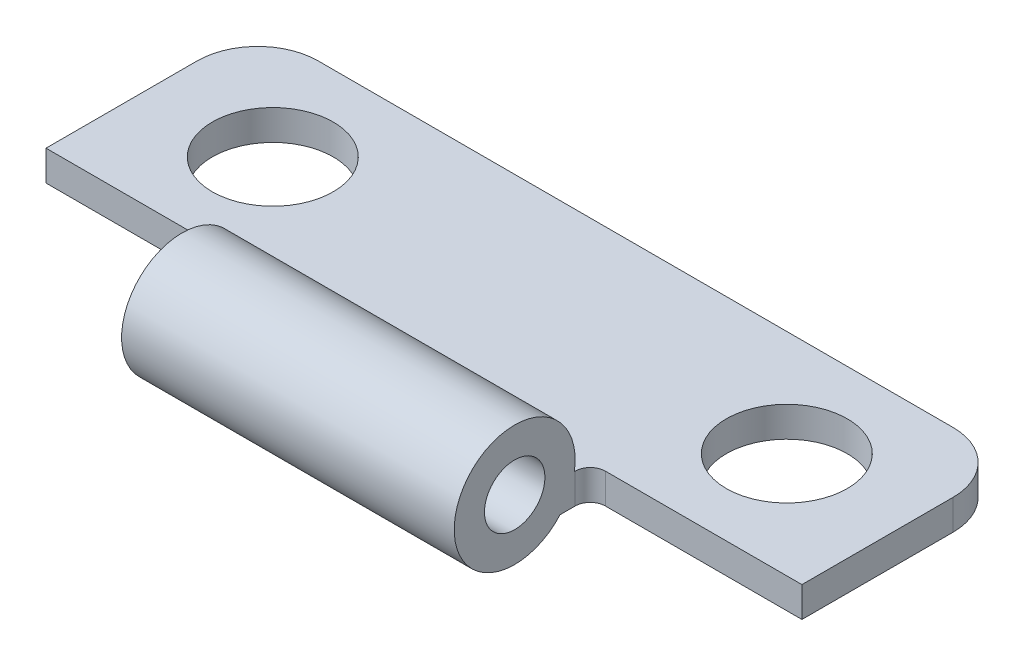
ISO-10303-21;
HEADER;
FILE_DESCRIPTION(('STEP AP214'),'2;1');
FILE_NAME('part.step','',(''),(''),'','','');
FILE_SCHEMA(('AUTOMOTIVE_DESIGN { 1 0 10303 214 1 1 1 1 }'));
ENDSEC;
DATA;
#1=APPLICATION_CONTEXT('core data for automotive mechanical design processes');
#2=APPLICATION_PROTOCOL_DEFINITION('international standard','automotive_design',2000,#1);
#3=PRODUCT_CONTEXT('',#1,'mechanical');
#4=PRODUCT('Part','Part','',(#3));
#5=PRODUCT_RELATED_PRODUCT_CATEGORY('part','',(#4));
#6=PRODUCT_DEFINITION_FORMATION('','',#4);
#7=PRODUCT_DEFINITION_CONTEXT('part definition',#1,'design');
#8=PRODUCT_DEFINITION('design','',#6,#7);
#9=PRODUCT_DEFINITION_SHAPE('','',#8);
#10=(LENGTH_UNIT() NAMED_UNIT(*) SI_UNIT(.MILLI.,.METRE.));
#11=(NAMED_UNIT(*) PLANE_ANGLE_UNIT() SI_UNIT($,.RADIAN.));
#12=(NAMED_UNIT(*) SI_UNIT($,.STERADIAN.) SOLID_ANGLE_UNIT());
#13=UNCERTAINTY_MEASURE_WITH_UNIT(LENGTH_MEASURE(1.E-05),#10,'distance_accuracy_value','');
#14=(GEOMETRIC_REPRESENTATION_CONTEXT(3) GLOBAL_UNCERTAINTY_ASSIGNED_CONTEXT((#13)) GLOBAL_UNIT_ASSIGNED_CONTEXT((#10,
#11,#12)) REPRESENTATION_CONTEXT('',''));
#15=CARTESIAN_POINT('',(0.,0.,0.));
#16=DIRECTION('',(0.,0.,1.));
#17=DIRECTION('',(1.,0.,0.));
#18=AXIS2_PLACEMENT_3D('',#15,#16,#17);
#19=CARTESIAN_POINT('',(0.,1.,0.));
#20=DIRECTION('',(0.,-1.,0.));
#21=DIRECTION('',(0.,0.,-1.));
#22=AXIS2_PLACEMENT_3D('',#19,#20,#21);
#23=PLANE('',#22);
#24=CARTESIAN_POINT('',(-8.5,1.,-4.5));
#25=DIRECTION('',(0.,1.,0.));
#26=DIRECTION('',(0.,0.,1.));
#27=AXIS2_PLACEMENT_3D('',#24,#25,#26);
#28=CIRCLE('',#27,2.);
#29=CARTESIAN_POINT('',(-8.5,1.,-2.5));
#30=VERTEX_POINT('',#29);
#31=EDGE_CURVE('E162',#30,#30,#28,.T.);
#32=ORIENTED_EDGE('',*,*,#31,.F.);
#33=EDGE_LOOP('',(#32));
#34=FACE_BOUND('',#33,.T.);
#35=CARTESIAN_POINT('',(8.5,1.,-4.5));
#36=DIRECTION('',(0.,1.,0.));
#37=DIRECTION('',(0.,0.,1.));
#38=AXIS2_PLACEMENT_3D('',#35,#36,#37);
#39=CIRCLE('',#38,2.);
#40=CARTESIAN_POINT('',(8.5,1.,-2.5));
#41=VERTEX_POINT('',#40);
#42=EDGE_CURVE('E166',#41,#41,#39,.T.);
#43=ORIENTED_EDGE('',*,*,#42,.F.);
#44=EDGE_LOOP('',(#43));
#45=FACE_BOUND('',#44,.T.);
#46=DIRECTION('',(-1.,0.,0.));
#47=VECTOR('',#46,1.);
#48=CARTESIAN_POINT('',(5.5,1.,-0.47376576904773));
#49=LINE('',#48,#47);
#50=CARTESIAN_POINT('',(5.5,1.,-0.47376576904773));
#51=VERTEX_POINT('',#50);
#52=CARTESIAN_POINT('',(-5.5,1.,-0.47376576904773));
#53=VERTEX_POINT('',#52);
#54=EDGE_CURVE('E56',#51,#53,#49,.T.);
#55=ORIENTED_EDGE('',*,*,#54,.F.);
#56=DIRECTION('',(0.,0.,-1.));
#57=VECTOR('',#56,1.);
#58=CARTESIAN_POINT('',(5.5,1.,0.));
#59=LINE('',#58,#57);
#60=CARTESIAN_POINT('',(5.5,1.,-0.499999999999997));
#61=VERTEX_POINT('',#60);
#62=EDGE_CURVE('E153',#51,#61,#59,.T.);
#63=ORIENTED_EDGE('',*,*,#62,.T.);
#64=CARTESIAN_POINT('',(6.,1.,-0.499999999999997));
#65=DIRECTION('',(0.,-1.,0.));
#66=DIRECTION('',(0.,0.,-1.));
#67=AXIS2_PLACEMENT_3D('',#64,#65,#66);
#68=CIRCLE('',#67,0.5);
#69=CARTESIAN_POINT('',(6.,1.,-0.999999999999997));
#70=VERTEX_POINT('',#69);
#71=EDGE_CURVE('E240',#61,#70,#68,.T.);
#72=ORIENTED_EDGE('',*,*,#71,.T.);
#73=DIRECTION('',(1.,0.,0.));
#74=VECTOR('',#73,1.);
#75=CARTESIAN_POINT('',(5.5,1.,-0.999999999999997));
#76=LINE('',#75,#74);
#77=CARTESIAN_POINT('',(12.5,1.,-0.999999999999996));
#78=VERTEX_POINT('',#77);
#79=EDGE_CURVE('E181',#70,#78,#76,.T.);
#80=ORIENTED_EDGE('',*,*,#79,.T.);
#81=DIRECTION('',(0.,0.,-1.));
#82=VECTOR('',#81,1.);
#83=CARTESIAN_POINT('',(12.5,1.,-8.));
#84=LINE('',#83,#82);
#85=CARTESIAN_POINT('',(12.5,1.,-6.));
#86=VERTEX_POINT('',#85);
#87=EDGE_CURVE('E183',#78,#86,#84,.T.);
#88=ORIENTED_EDGE('',*,*,#87,.T.);
#89=CARTESIAN_POINT('',(10.5,1.,-6.));
#90=DIRECTION('',(0.,-1.,0.));
#91=DIRECTION('',(0.,0.,-1.));
#92=AXIS2_PLACEMENT_3D('',#89,#90,#91);
#93=CIRCLE('',#92,2.);
#94=CARTESIAN_POINT('',(10.5,1.,-8.));
#95=VERTEX_POINT('',#94);
#96=EDGE_CURVE('E219',#86,#95,#93,.F.);
#97=ORIENTED_EDGE('',*,*,#96,.T.);
#98=DIRECTION('',(-1.,0.,0.));
#99=VECTOR('',#98,1.);
#100=CARTESIAN_POINT('',(-12.5,1.,-8.));
#101=LINE('',#100,#99);
#102=CARTESIAN_POINT('',(-10.5,1.,-8.));
#103=VERTEX_POINT('',#102);
#104=EDGE_CURVE('E190',#95,#103,#101,.T.);
#105=ORIENTED_EDGE('',*,*,#104,.T.);
#106=CARTESIAN_POINT('',(-10.5,1.,-6.));
#107=DIRECTION('',(0.,-1.,0.));
#108=DIRECTION('',(0.,0.,-1.));
#109=AXIS2_PLACEMENT_3D('',#106,#107,#108);
#110=CIRCLE('',#109,2.);
#111=CARTESIAN_POINT('',(-12.5,1.,-6.));
#112=VERTEX_POINT('',#111);
#113=EDGE_CURVE('E225',#103,#112,#110,.F.);
#114=ORIENTED_EDGE('',*,*,#113,.T.);
#115=DIRECTION('',(0.,0.,1.));
#116=VECTOR('',#115,1.);
#117=CARTESIAN_POINT('',(-12.5,1.,-0.999999999999996));
#118=LINE('',#117,#116);
#119=CARTESIAN_POINT('',(-12.5,1.,-0.999999999999996));
#120=VERTEX_POINT('',#119);
#121=EDGE_CURVE('E173',#112,#120,#118,.T.);
#122=ORIENTED_EDGE('',*,*,#121,.T.);
#123=DIRECTION('',(1.,0.,0.));
#124=VECTOR('',#123,1.);
#125=CARTESIAN_POINT('',(-12.5,1.,-0.999999999999996));
#126=LINE('',#125,#124);
#127=CARTESIAN_POINT('',(-6.,1.,-0.999999999999997));
#128=VERTEX_POINT('',#127);
#129=EDGE_CURVE('E180',#120,#128,#126,.T.);
#130=ORIENTED_EDGE('',*,*,#129,.T.);
#131=CARTESIAN_POINT('',(-6.,1.,-0.499999999999997));
#132=DIRECTION('',(0.,-1.,0.));
#133=DIRECTION('',(0.,0.,-1.));
#134=AXIS2_PLACEMENT_3D('',#131,#132,#133);
#135=CIRCLE('',#134,0.5);
#136=CARTESIAN_POINT('',(-5.5,1.,-0.499999999999997));
#137=VERTEX_POINT('',#136);
#138=EDGE_CURVE('E11',#128,#137,#135,.T.);
#139=ORIENTED_EDGE('',*,*,#138,.T.);
#140=DIRECTION('',(0.,0.,1.));
#141=VECTOR('',#140,1.);
#142=CARTESIAN_POINT('',(-5.5,1.,0.));
#143=LINE('',#142,#141);
#144=EDGE_CURVE('E54',#137,#53,#143,.T.);
#145=ORIENTED_EDGE('',*,*,#144,.T.);
#146=EDGE_LOOP('',(#55,#63,#72,#80,#88,#97,#105,#114,#122,#130,#139,#145));
#147=FACE_BOUND('',#146,.T.);
#148=ADVANCED_FACE('F41',(#34,#45,#147),#23,.F.);
#149=CARTESIAN_POINT('',(0.,0.,0.));
#150=DIRECTION('',(0.,-1.,0.));
#151=DIRECTION('',(0.,0.,-1.));
#152=AXIS2_PLACEMENT_3D('',#149,#150,#151);
#153=PLANE('',#152);
#154=CARTESIAN_POINT('',(8.5,0.,-4.5));
#155=DIRECTION('',(0.,1.,0.));
#156=DIRECTION('',(0.,0.,1.));
#157=AXIS2_PLACEMENT_3D('',#154,#155,#156);
#158=CIRCLE('',#157,2.);
#159=CARTESIAN_POINT('',(8.5,0.,-2.5));
#160=VERTEX_POINT('',#159);
#161=EDGE_CURVE('E167',#160,#160,#158,.T.);
#162=ORIENTED_EDGE('',*,*,#161,.T.);
#163=EDGE_LOOP('',(#162));
#164=FACE_BOUND('',#163,.T.);
#165=DIRECTION('',(0.,0.,1.));
#166=VECTOR('',#165,1.);
#167=CARTESIAN_POINT('',(-12.5,0.,-0.999999999999996));
#168=LINE('',#167,#166);
#169=CARTESIAN_POINT('',(-12.5,0.,-6.));
#170=VERTEX_POINT('',#169);
#171=CARTESIAN_POINT('',(-12.5,0.,-0.999999999999996));
#172=VERTEX_POINT('',#171);
#173=EDGE_CURVE('E174',#170,#172,#168,.T.);
#174=ORIENTED_EDGE('',*,*,#173,.F.);
#175=CARTESIAN_POINT('',(-10.5,0.,-6.));
#176=DIRECTION('',(0.,-1.,0.));
#177=DIRECTION('',(0.,0.,-1.));
#178=AXIS2_PLACEMENT_3D('',#175,#176,#177);
#179=CIRCLE('',#178,2.);
#180=CARTESIAN_POINT('',(-10.5,0.,-8.));
#181=VERTEX_POINT('',#180);
#182=EDGE_CURVE('E213',#170,#181,#179,.T.);
#183=ORIENTED_EDGE('',*,*,#182,.T.);
#184=DIRECTION('',(-1.,0.,0.));
#185=VECTOR('',#184,1.);
#186=CARTESIAN_POINT('',(-12.5,0.,-8.));
#187=LINE('',#186,#185);
#188=CARTESIAN_POINT('',(10.5,0.,-8.));
#189=VERTEX_POINT('',#188);
#190=EDGE_CURVE('E179',#189,#181,#187,.T.);
#191=ORIENTED_EDGE('',*,*,#190,.F.);
#192=CARTESIAN_POINT('',(10.5,0.,-6.));
#193=DIRECTION('',(0.,-1.,0.));
#194=DIRECTION('',(0.,0.,-1.));
#195=AXIS2_PLACEMENT_3D('',#192,#193,#194);
#196=CIRCLE('',#195,2.);
#197=CARTESIAN_POINT('',(12.5,0.,-6.));
#198=VERTEX_POINT('',#197);
#199=EDGE_CURVE('E211',#189,#198,#196,.T.);
#200=ORIENTED_EDGE('',*,*,#199,.T.);
#201=DIRECTION('',(0.,0.,-1.));
#202=VECTOR('',#201,1.);
#203=CARTESIAN_POINT('',(12.5,0.,-8.));
#204=LINE('',#203,#202);
#205=CARTESIAN_POINT('',(12.5,0.,-0.999999999999996));
#206=VERTEX_POINT('',#205);
#207=EDGE_CURVE('E196',#206,#198,#204,.T.);
#208=ORIENTED_EDGE('',*,*,#207,.F.);
#209=DIRECTION('',(1.,0.,0.));
#210=VECTOR('',#209,1.);
#211=CARTESIAN_POINT('',(5.5,0.,-0.999999999999997));
#212=LINE('',#211,#210);
#213=CARTESIAN_POINT('',(6.,0.,-0.999999999999997));
#214=VERTEX_POINT('',#213);
#215=EDGE_CURVE('E143',#214,#206,#212,.T.);
#216=ORIENTED_EDGE('',*,*,#215,.F.);
#217=CARTESIAN_POINT('',(6.,0.,-0.499999999999997));
#218=DIRECTION('',(0.,-1.,0.));
#219=DIRECTION('',(0.,0.,-1.));
#220=AXIS2_PLACEMENT_3D('',#217,#218,#219);
#221=CIRCLE('',#220,0.5);
#222=CARTESIAN_POINT('',(5.5,0.,-0.499999999999997));
#223=VERTEX_POINT('',#222);
#224=EDGE_CURVE('E137',#214,#223,#221,.F.);
#225=ORIENTED_EDGE('',*,*,#224,.T.);
#226=DIRECTION('',(0.,0.,-1.));
#227=VECTOR('',#226,1.);
#228=CARTESIAN_POINT('',(5.5,0.,0.));
#229=LINE('',#228,#227);
#230=CARTESIAN_POINT('',(5.5,0.,0.));
#231=VERTEX_POINT('',#230);
#232=EDGE_CURVE('E130',#231,#223,#229,.T.);
#233=ORIENTED_EDGE('',*,*,#232,.F.);
#234=DIRECTION('',(1.,0.,0.));
#235=VECTOR('',#234,1.);
#236=CARTESIAN_POINT('',(-5.5,0.,0.));
#237=LINE('',#236,#235);
#238=CARTESIAN_POINT('',(-5.5,0.,0.));
#239=VERTEX_POINT('',#238);
#240=EDGE_CURVE('E135',#239,#231,#237,.T.);
#241=ORIENTED_EDGE('',*,*,#240,.F.);
#242=DIRECTION('',(0.,0.,1.));
#243=VECTOR('',#242,1.);
#244=CARTESIAN_POINT('',(-5.5,0.,0.));
#245=LINE('',#244,#243);
#246=CARTESIAN_POINT('',(-5.5,0.,-0.499999999999997));
#247=VERTEX_POINT('',#246);
#248=EDGE_CURVE('E149',#247,#239,#245,.T.);
#249=ORIENTED_EDGE('',*,*,#248,.F.);
#250=CARTESIAN_POINT('',(-6.,0.,-0.499999999999997));
#251=DIRECTION('',(0.,-1.,0.));
#252=DIRECTION('',(0.,0.,-1.));
#253=AXIS2_PLACEMENT_3D('',#250,#251,#252);
#254=CIRCLE('',#253,0.5);
#255=CARTESIAN_POINT('',(-6.,0.,-0.999999999999997));
#256=VERTEX_POINT('',#255);
#257=EDGE_CURVE('E47',#247,#256,#254,.F.);
#258=ORIENTED_EDGE('',*,*,#257,.T.);
#259=DIRECTION('',(1.,0.,0.));
#260=VECTOR('',#259,1.);
#261=CARTESIAN_POINT('',(-12.5,0.,-0.999999999999996));
#262=LINE('',#261,#260);
#263=EDGE_CURVE('E194',#172,#256,#262,.T.);
#264=ORIENTED_EDGE('',*,*,#263,.F.);
#265=EDGE_LOOP('',(#174,#183,#191,#200,#208,#216,#225,#233,#241,#249,#258,#264));
#266=FACE_BOUND('',#265,.T.);
#267=CARTESIAN_POINT('',(-8.5,0.,-4.5));
#268=DIRECTION('',(0.,1.,0.));
#269=DIRECTION('',(0.,0.,1.));
#270=AXIS2_PLACEMENT_3D('',#267,#268,#269);
#271=CIRCLE('',#270,2.);
#272=CARTESIAN_POINT('',(-8.5,0.,-2.5));
#273=VERTEX_POINT('',#272);
#274=EDGE_CURVE('E154',#273,#273,#271,.T.);
#275=ORIENTED_EDGE('',*,*,#274,.T.);
#276=EDGE_LOOP('',(#275));
#277=FACE_BOUND('',#276,.T.);
#278=ADVANCED_FACE('F128',(#164,#266,#277),#153,.T.);
#279=CARTESIAN_POINT('',(-12.5,1.,-0.999999999999996));
#280=DIRECTION('',(1.,0.,0.));
#281=DIRECTION('',(0.,0.,-1.));
#282=AXIS2_PLACEMENT_3D('',#279,#280,#281);
#283=PLANE('',#282);
#284=ORIENTED_EDGE('',*,*,#121,.F.);
#285=DIRECTION('',(0.,-1.,0.));
#286=VECTOR('',#285,1.);
#287=CARTESIAN_POINT('',(-12.5,1.,-6.));
#288=LINE('',#287,#286);
#289=EDGE_CURVE('E208',#112,#170,#288,.T.);
#290=ORIENTED_EDGE('',*,*,#289,.T.);
#291=ORIENTED_EDGE('',*,*,#173,.T.);
#292=DIRECTION('',(0.,-1.,0.));
#293=VECTOR('',#292,1.);
#294=CARTESIAN_POINT('',(-12.5,1.,-0.999999999999996));
#295=LINE('',#294,#293);
#296=EDGE_CURVE('E202',#120,#172,#295,.T.);
#297=ORIENTED_EDGE('',*,*,#296,.F.);
#298=EDGE_LOOP('',(#284,#290,#291,#297));
#299=FACE_BOUND('',#298,.T.);
#300=ADVANCED_FACE('F277',(#299),#283,.F.);
#301=CARTESIAN_POINT('',(-12.5,1.,-0.999999999999996));
#302=DIRECTION('',(0.,0.,-1.));
#303=DIRECTION('',(-1.,0.,0.));
#304=AXIS2_PLACEMENT_3D('',#301,#302,#303);
#305=PLANE('',#304);
#306=ORIENTED_EDGE('',*,*,#263,.T.);
#307=DIRECTION('',(0.,-1.,0.));
#308=VECTOR('',#307,1.);
#309=CARTESIAN_POINT('',(-6.,1.,-0.999999999999997));
#310=LINE('',#309,#308);
#311=EDGE_CURVE('E231',#256,#128,#310,.F.);
#312=ORIENTED_EDGE('',*,*,#311,.T.);
#313=ORIENTED_EDGE('',*,*,#129,.F.);
#314=ORIENTED_EDGE('',*,*,#296,.T.);
#315=EDGE_LOOP('',(#306,#312,#313,#314));
#316=FACE_BOUND('',#315,.T.);
#317=ADVANCED_FACE('F245',(#316),#305,.F.);
#318=CARTESIAN_POINT('',(-5.5,1.,0.));
#319=DIRECTION('',(1.,0.,0.));
#320=DIRECTION('',(0.,0.,-1.));
#321=AXIS2_PLACEMENT_3D('',#318,#319,#320);
#322=PLANE('',#321);
#323=ORIENTED_EDGE('',*,*,#248,.T.);
#324=CARTESIAN_POINT('',(-5.5,1.32287565553229,1.5));
#325=DIRECTION('',(1.,0.,0.));
#326=DIRECTION('',(0.,0.,-1.));
#327=AXIS2_PLACEMENT_3D('',#324,#325,#326);
#328=CIRCLE('',#327,2.);
#329=EDGE_CURVE('E146',#53,#239,#328,.T.);
#330=ORIENTED_EDGE('',*,*,#329,.F.);
#331=ORIENTED_EDGE('',*,*,#144,.F.);
#332=DIRECTION('',(0.,-1.,0.));
#333=VECTOR('',#332,1.);
#334=CARTESIAN_POINT('',(-5.5,0.,-0.499999999999997));
#335=LINE('',#334,#333);
#336=EDGE_CURVE('E232',#137,#247,#335,.T.);
#337=ORIENTED_EDGE('',*,*,#336,.T.);
#338=EDGE_LOOP('',(#323,#330,#331,#337));
#339=FACE_BOUND('',#338,.T.);
#340=CARTESIAN_POINT('',(-5.5,1.32287565553229,1.5));
#341=DIRECTION('',(1.,0.,0.));
#342=DIRECTION('',(0.,0.,-1.));
#343=AXIS2_PLACEMENT_3D('',#340,#341,#342);
#344=CIRCLE('',#343,1.);
#345=CARTESIAN_POINT('',(-5.5,1.32287565553229,0.500000000000004));
#346=VERTEX_POINT('',#345);
#347=EDGE_CURVE('E159',#346,#346,#344,.T.);
#348=ORIENTED_EDGE('',*,*,#347,.T.);
#349=EDGE_LOOP('',(#348));
#350=FACE_BOUND('',#349,.T.);
#351=ADVANCED_FACE('F249',(#339,#350),#322,.F.);
#352=CARTESIAN_POINT('',(5.5,1.,0.));
#353=DIRECTION('',(-1.,0.,0.));
#354=DIRECTION('',(0.,0.,1.));
#355=AXIS2_PLACEMENT_3D('',#352,#353,#354);
#356=PLANE('',#355);
#357=ORIENTED_EDGE('',*,*,#62,.F.);
#358=CARTESIAN_POINT('',(5.5,1.32287565553229,1.5));
#359=DIRECTION('',(1.,0.,0.));
#360=DIRECTION('',(0.,0.,-1.));
#361=AXIS2_PLACEMENT_3D('',#358,#359,#360);
#362=CIRCLE('',#361,2.);
#363=EDGE_CURVE('E148',#51,#231,#362,.T.);
#364=ORIENTED_EDGE('',*,*,#363,.T.);
#365=ORIENTED_EDGE('',*,*,#232,.T.);
#366=DIRECTION('',(0.,-1.,0.));
#367=VECTOR('',#366,1.);
#368=CARTESIAN_POINT('',(5.5,1.,-0.499999999999997));
#369=LINE('',#368,#367);
#370=EDGE_CURVE('E226',#223,#61,#369,.F.);
#371=ORIENTED_EDGE('',*,*,#370,.T.);
#372=EDGE_LOOP('',(#357,#364,#365,#371));
#373=FACE_BOUND('',#372,.T.);
#374=CARTESIAN_POINT('',(5.5,1.32287565553229,1.5));
#375=DIRECTION('',(1.,0.,0.));
#376=DIRECTION('',(0.,0.,-1.));
#377=AXIS2_PLACEMENT_3D('',#374,#375,#376);
#378=CIRCLE('',#377,1.);
#379=CARTESIAN_POINT('',(5.5,1.32287565553229,0.500000000000004));
#380=VERTEX_POINT('',#379);
#381=EDGE_CURVE('E160',#380,#380,#378,.T.);
#382=ORIENTED_EDGE('',*,*,#381,.F.);
#383=EDGE_LOOP('',(#382));
#384=FACE_BOUND('',#383,.T.);
#385=ADVANCED_FACE('F151',(#373,#384),#356,.F.);
#386=CARTESIAN_POINT('',(5.5,1.,-0.999999999999997));
#387=DIRECTION('',(0.,0.,-1.));
#388=DIRECTION('',(-1.,0.,0.));
#389=AXIS2_PLACEMENT_3D('',#386,#387,#388);
#390=PLANE('',#389);
#391=ORIENTED_EDGE('',*,*,#79,.F.);
#392=DIRECTION('',(0.,-1.,0.));
#393=VECTOR('',#392,1.);
#394=CARTESIAN_POINT('',(6.,0.,-0.999999999999997));
#395=LINE('',#394,#393);
#396=EDGE_CURVE('E227',#70,#214,#395,.T.);
#397=ORIENTED_EDGE('',*,*,#396,.T.);
#398=ORIENTED_EDGE('',*,*,#215,.T.);
#399=DIRECTION('',(0.,-1.,0.));
#400=VECTOR('',#399,1.);
#401=CARTESIAN_POINT('',(12.5,1.,-0.999999999999996));
#402=LINE('',#401,#400);
#403=EDGE_CURVE('E192',#78,#206,#402,.T.);
#404=ORIENTED_EDGE('',*,*,#403,.F.);
#405=EDGE_LOOP('',(#391,#397,#398,#404));
#406=FACE_BOUND('',#405,.T.);
#407=ADVANCED_FACE('F257',(#406),#390,.F.);
#408=CARTESIAN_POINT('',(12.5,1.,-8.));
#409=DIRECTION('',(-1.,0.,0.));
#410=DIRECTION('',(0.,0.,1.));
#411=AXIS2_PLACEMENT_3D('',#408,#409,#410);
#412=PLANE('',#411);
#413=ORIENTED_EDGE('',*,*,#207,.T.);
#414=DIRECTION('',(0.,-1.,0.));
#415=VECTOR('',#414,1.);
#416=CARTESIAN_POINT('',(12.5,1.,-6.));
#417=LINE('',#416,#415);
#418=EDGE_CURVE('E221',#198,#86,#417,.F.);
#419=ORIENTED_EDGE('',*,*,#418,.T.);
#420=ORIENTED_EDGE('',*,*,#87,.F.);
#421=ORIENTED_EDGE('',*,*,#403,.T.);
#422=EDGE_LOOP('',(#413,#419,#420,#421));
#423=FACE_BOUND('',#422,.T.);
#424=ADVANCED_FACE('F266',(#423),#412,.F.);
#425=CARTESIAN_POINT('',(-12.5,1.,-8.));
#426=DIRECTION('',(0.,0.,1.));
#427=DIRECTION('',(1.,0.,0.));
#428=AXIS2_PLACEMENT_3D('',#425,#426,#427);
#429=PLANE('',#428);
#430=ORIENTED_EDGE('',*,*,#190,.T.);
#431=DIRECTION('',(0.,-1.,0.));
#432=VECTOR('',#431,1.);
#433=CARTESIAN_POINT('',(-10.5,1.,-8.));
#434=LINE('',#433,#432);
#435=EDGE_CURVE('E217',#181,#103,#434,.F.);
#436=ORIENTED_EDGE('',*,*,#435,.T.);
#437=ORIENTED_EDGE('',*,*,#104,.F.);
#438=DIRECTION('',(0.,-1.,0.));
#439=VECTOR('',#438,1.);
#440=CARTESIAN_POINT('',(10.5,1.,-8.));
#441=LINE('',#440,#439);
#442=EDGE_CURVE('E214',#95,#189,#441,.T.);
#443=ORIENTED_EDGE('',*,*,#442,.T.);
#444=EDGE_LOOP('',(#430,#436,#437,#443));
#445=FACE_BOUND('',#444,.T.);
#446=ADVANCED_FACE('F283',(#445),#429,.F.);
#447=CARTESIAN_POINT('',(8.5,1.,-4.5));
#448=DIRECTION('',(0.,-1.,0.));
#449=DIRECTION('',(0.,0.,-1.));
#450=AXIS2_PLACEMENT_3D('',#447,#448,#449);
#451=CYLINDRICAL_SURFACE('',#450,2.);
#452=ORIENTED_EDGE('',*,*,#42,.T.);
#453=EDGE_LOOP('',(#452));
#454=FACE_BOUND('',#453,.T.);
#455=ORIENTED_EDGE('',*,*,#161,.F.);
#456=EDGE_LOOP('',(#455));
#457=FACE_BOUND('',#456,.T.);
#458=ADVANCED_FACE('F284',(#454,#457),#451,.F.);
#459=CARTESIAN_POINT('',(-8.5,1.,-4.5));
#460=DIRECTION('',(0.,-1.,0.));
#461=DIRECTION('',(0.,0.,-1.));
#462=AXIS2_PLACEMENT_3D('',#459,#460,#461);
#463=CYLINDRICAL_SURFACE('',#462,2.);
#464=ORIENTED_EDGE('',*,*,#31,.T.);
#465=EDGE_LOOP('',(#464));
#466=FACE_BOUND('',#465,.T.);
#467=ORIENTED_EDGE('',*,*,#274,.F.);
#468=EDGE_LOOP('',(#467));
#469=FACE_BOUND('',#468,.T.);
#470=ADVANCED_FACE('F319',(#466,#469),#463,.F.);
#471=CARTESIAN_POINT('',(-10.5,1.,-6.));
#472=DIRECTION('',(0.,-1.,0.));
#473=DIRECTION('',(0.,0.,-1.));
#474=AXIS2_PLACEMENT_3D('',#471,#472,#473);
#475=CYLINDRICAL_SURFACE('',#474,2.);
#476=ORIENTED_EDGE('',*,*,#113,.F.);
#477=ORIENTED_EDGE('',*,*,#435,.F.);
#478=ORIENTED_EDGE('',*,*,#182,.F.);
#479=ORIENTED_EDGE('',*,*,#289,.F.);
#480=EDGE_LOOP('',(#476,#477,#478,#479));
#481=FACE_BOUND('',#480,.T.);
#482=ADVANCED_FACE('F307',(#481),#475,.T.);
#483=CARTESIAN_POINT('',(10.5,1.,-6.));
#484=DIRECTION('',(0.,-1.,0.));
#485=DIRECTION('',(0.,0.,-1.));
#486=AXIS2_PLACEMENT_3D('',#483,#484,#485);
#487=CYLINDRICAL_SURFACE('',#486,2.);
#488=ORIENTED_EDGE('',*,*,#96,.F.);
#489=ORIENTED_EDGE('',*,*,#418,.F.);
#490=ORIENTED_EDGE('',*,*,#199,.F.);
#491=ORIENTED_EDGE('',*,*,#442,.F.);
#492=EDGE_LOOP('',(#488,#489,#490,#491));
#493=FACE_BOUND('',#492,.T.);
#494=ADVANCED_FACE('F298',(#493),#487,.T.);
#495=CARTESIAN_POINT('',(6.,1.,-0.499999999999997));
#496=DIRECTION('',(0.,1.,0.));
#497=DIRECTION('',(0.,0.,1.));
#498=AXIS2_PLACEMENT_3D('',#495,#496,#497);
#499=CYLINDRICAL_SURFACE('',#498,0.5);
#500=ORIENTED_EDGE('',*,*,#71,.F.);
#501=ORIENTED_EDGE('',*,*,#370,.F.);
#502=ORIENTED_EDGE('',*,*,#224,.F.);
#503=ORIENTED_EDGE('',*,*,#396,.F.);
#504=EDGE_LOOP('',(#500,#501,#502,#503));
#505=FACE_BOUND('',#504,.T.);
#506=ADVANCED_FACE('F325',(#505),#499,.F.);
#507=CARTESIAN_POINT('',(-6.,1.,-0.499999999999997));
#508=DIRECTION('',(0.,1.,0.));
#509=DIRECTION('',(0.,0.,1.));
#510=AXIS2_PLACEMENT_3D('',#507,#508,#509);
#511=CYLINDRICAL_SURFACE('',#510,0.5);
#512=ORIENTED_EDGE('',*,*,#138,.F.);
#513=ORIENTED_EDGE('',*,*,#311,.F.);
#514=ORIENTED_EDGE('',*,*,#257,.F.);
#515=ORIENTED_EDGE('',*,*,#336,.F.);
#516=EDGE_LOOP('',(#512,#513,#514,#515));
#517=FACE_BOUND('',#516,.T.);
#518=ADVANCED_FACE('F43',(#517),#511,.F.);
#519=CARTESIAN_POINT('',(5.5,1.32287565553229,1.5));
#520=DIRECTION('',(-1.,0.,0.));
#521=DIRECTION('',(0.,0.,1.));
#522=AXIS2_PLACEMENT_3D('',#519,#520,#521);
#523=CYLINDRICAL_SURFACE('',#522,2.);
#524=ORIENTED_EDGE('',*,*,#363,.F.);
#525=ORIENTED_EDGE('',*,*,#54,.T.);
#526=ORIENTED_EDGE('',*,*,#329,.T.);
#527=ORIENTED_EDGE('',*,*,#240,.T.);
#528=EDGE_LOOP('',(#524,#525,#526,#527));
#529=FACE_BOUND('',#528,.T.);
#530=ADVANCED_FACE('F144',(#529),#523,.T.);
#531=CARTESIAN_POINT('',(5.5,1.32287565553229,1.5));
#532=DIRECTION('',(-1.,0.,0.));
#533=DIRECTION('',(0.,0.,1.));
#534=AXIS2_PLACEMENT_3D('',#531,#532,#533);
#535=CYLINDRICAL_SURFACE('',#534,1.);
#536=ORIENTED_EDGE('',*,*,#381,.T.);
#537=EDGE_LOOP('',(#536));
#538=FACE_BOUND('',#537,.T.);
#539=ORIENTED_EDGE('',*,*,#347,.F.);
#540=EDGE_LOOP('',(#539));
#541=FACE_BOUND('',#540,.T.);
#542=ADVANCED_FACE('F256',(#538,#541),#535,.F.);
#543=CLOSED_SHELL('',(#148,#278,#300,#317,#351,#385,#407,#424,#446,#458,#470,#482,#494,#506,
#518,#530,#542));
#544=MANIFOLD_SOLID_BREP('B2',#543);
#545=ADVANCED_BREP_SHAPE_REPRESENTATION('',(#18,#544),#14);
#546=SHAPE_DEFINITION_REPRESENTATION(#9,#545);
ENDSEC;
END-ISO-10303-21;
